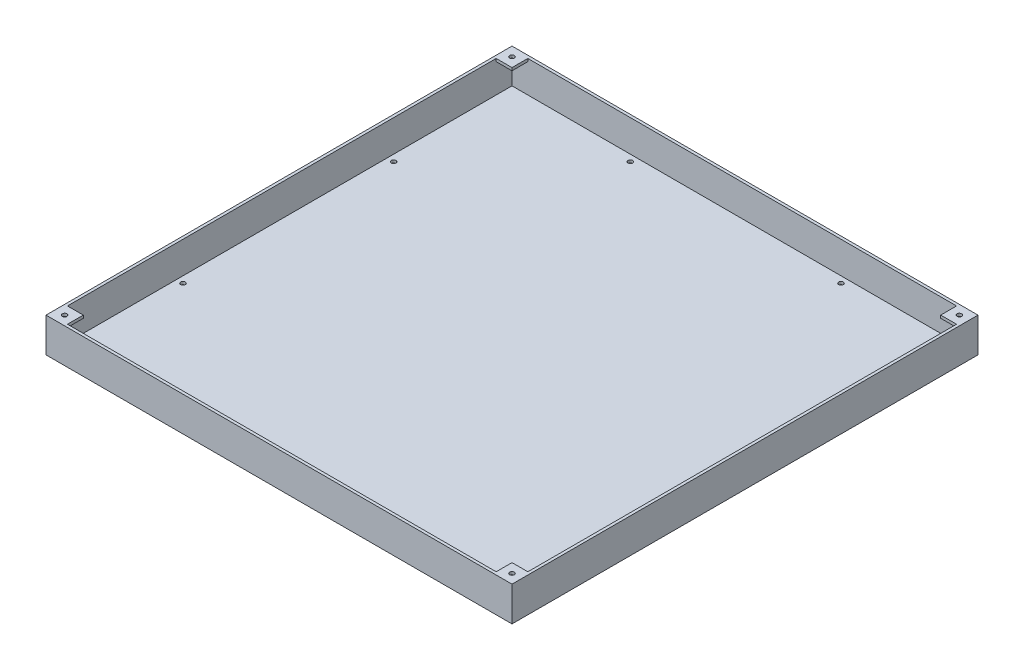
ISO-10303-21;
HEADER;
FILE_DESCRIPTION(('STEP AP214'),'2;1');
FILE_NAME('part.step','',(''),(''),'','','');
FILE_SCHEMA(('AUTOMOTIVE_DESIGN { 1 0 10303 214 1 1 1 1 }'));
ENDSEC;
DATA;
#1=APPLICATION_CONTEXT('core data for automotive mechanical design processes');
#2=APPLICATION_PROTOCOL_DEFINITION('international standard','automotive_design',2000,#1);
#3=PRODUCT_CONTEXT('',#1,'mechanical');
#4=PRODUCT('Part','Part','',(#3));
#5=PRODUCT_RELATED_PRODUCT_CATEGORY('part','',(#4));
#6=PRODUCT_DEFINITION_FORMATION('','',#4);
#7=PRODUCT_DEFINITION_CONTEXT('part definition',#1,'design');
#8=PRODUCT_DEFINITION('design','',#6,#7);
#9=PRODUCT_DEFINITION_SHAPE('','',#8);
#10=(LENGTH_UNIT() NAMED_UNIT(*) SI_UNIT(.MILLI.,.METRE.));
#11=(NAMED_UNIT(*) PLANE_ANGLE_UNIT() SI_UNIT($,.RADIAN.));
#12=(NAMED_UNIT(*) SI_UNIT($,.STERADIAN.) SOLID_ANGLE_UNIT());
#13=UNCERTAINTY_MEASURE_WITH_UNIT(LENGTH_MEASURE(1.E-05),#10,'distance_accuracy_value','');
#14=(GEOMETRIC_REPRESENTATION_CONTEXT(3) GLOBAL_UNCERTAINTY_ASSIGNED_CONTEXT((#13)) GLOBAL_UNIT_ASSIGNED_CONTEXT((#10,
#11,#12)) REPRESENTATION_CONTEXT('',''));
#15=CARTESIAN_POINT('',(0.,0.,0.));
#16=DIRECTION('',(0.,0.,1.));
#17=DIRECTION('',(1.,0.,0.));
#18=AXIS2_PLACEMENT_3D('',#15,#16,#17);
#19=CARTESIAN_POINT('',(250.,37.,-250.));
#20=DIRECTION('',(-1.,0.,0.));
#21=DIRECTION('',(0.,0.,1.));
#22=AXIS2_PLACEMENT_3D('',#19,#20,#21);
#23=PLANE('',#22);
#24=DIRECTION('',(0.,0.,-1.));
#25=VECTOR('',#24,1.);
#26=CARTESIAN_POINT('',(250.,0.,-250.));
#27=LINE('',#26,#25);
#28=CARTESIAN_POINT('',(250.,0.,250.));
#29=VERTEX_POINT('',#28);
#30=CARTESIAN_POINT('',(250.,0.,-250.));
#31=VERTEX_POINT('',#30);
#32=EDGE_CURVE('E302',#29,#31,#27,.T.);
#33=ORIENTED_EDGE('',*,*,#32,.T.);
#34=DIRECTION('',(0.,-1.,0.));
#35=VECTOR('',#34,1.);
#36=CARTESIAN_POINT('',(250.,37.,-250.));
#37=LINE('',#36,#35);
#38=CARTESIAN_POINT('',(250.,37.,-250.));
#39=VERTEX_POINT('',#38);
#40=EDGE_CURVE('E11',#39,#31,#37,.T.);
#41=ORIENTED_EDGE('',*,*,#40,.F.);
#42=DIRECTION('',(0.,0.,-1.));
#43=VECTOR('',#42,1.);
#44=CARTESIAN_POINT('',(250.,37.,-250.));
#45=LINE('',#44,#43);
#46=CARTESIAN_POINT('',(250.,37.,250.));
#47=VERTEX_POINT('',#46);
#48=EDGE_CURVE('E324',#47,#39,#45,.T.);
#49=ORIENTED_EDGE('',*,*,#48,.F.);
#50=DIRECTION('',(0.,-1.,0.));
#51=VECTOR('',#50,1.);
#52=CARTESIAN_POINT('',(250.,37.,250.));
#53=LINE('',#52,#51);
#54=EDGE_CURVE('E334',#47,#29,#53,.T.);
#55=ORIENTED_EDGE('',*,*,#54,.T.);
#56=EDGE_LOOP('',(#33,#41,#49,#55));
#57=FACE_BOUND('',#56,.T.);
#58=ADVANCED_FACE('F33',(#57),#23,.F.);
#59=CARTESIAN_POINT('',(-250.,37.,-250.));
#60=DIRECTION('',(0.,0.,1.));
#61=DIRECTION('',(1.,0.,0.));
#62=AXIS2_PLACEMENT_3D('',#59,#60,#61);
#63=PLANE('',#62);
#64=DIRECTION('',(-1.,0.,0.));
#65=VECTOR('',#64,1.);
#66=CARTESIAN_POINT('',(-250.,0.,-250.));
#67=LINE('',#66,#65);
#68=CARTESIAN_POINT('',(-250.,0.,-250.));
#69=VERTEX_POINT('',#68);
#70=EDGE_CURVE('E337',#31,#69,#67,.T.);
#71=ORIENTED_EDGE('',*,*,#70,.T.);
#72=DIRECTION('',(0.,-1.,0.));
#73=VECTOR('',#72,1.);
#74=CARTESIAN_POINT('',(-250.,37.,-250.));
#75=LINE('',#74,#73);
#76=CARTESIAN_POINT('',(-250.,37.,-250.));
#77=VERTEX_POINT('',#76);
#78=EDGE_CURVE('E41',#77,#69,#75,.T.);
#79=ORIENTED_EDGE('',*,*,#78,.F.);
#80=DIRECTION('',(-1.,0.,0.));
#81=VECTOR('',#80,1.);
#82=CARTESIAN_POINT('',(-250.,37.,-250.));
#83=LINE('',#82,#81);
#84=EDGE_CURVE('E327',#39,#77,#83,.T.);
#85=ORIENTED_EDGE('',*,*,#84,.F.);
#86=ORIENTED_EDGE('',*,*,#40,.T.);
#87=EDGE_LOOP('',(#71,#79,#85,#86));
#88=FACE_BOUND('',#87,.T.);
#89=ADVANCED_FACE('F481',(#88),#63,.F.);
#90=CARTESIAN_POINT('',(-250.,37.,-250.));
#91=DIRECTION('',(1.,0.,0.));
#92=DIRECTION('',(0.,0.,-1.));
#93=AXIS2_PLACEMENT_3D('',#90,#91,#92);
#94=PLANE('',#93);
#95=DIRECTION('',(0.,0.,1.));
#96=VECTOR('',#95,1.);
#97=CARTESIAN_POINT('',(-250.,0.,-250.));
#98=LINE('',#97,#96);
#99=CARTESIAN_POINT('',(-250.,0.,250.));
#100=VERTEX_POINT('',#99);
#101=EDGE_CURVE('E339',#69,#100,#98,.T.);
#102=ORIENTED_EDGE('',*,*,#101,.T.);
#103=DIRECTION('',(0.,-1.,0.));
#104=VECTOR('',#103,1.);
#105=CARTESIAN_POINT('',(-250.,37.,250.));
#106=LINE('',#105,#104);
#107=CARTESIAN_POINT('',(-250.,37.,250.));
#108=VERTEX_POINT('',#107);
#109=EDGE_CURVE('E344',#108,#100,#106,.T.);
#110=ORIENTED_EDGE('',*,*,#109,.F.);
#111=DIRECTION('',(0.,0.,1.));
#112=VECTOR('',#111,1.);
#113=CARTESIAN_POINT('',(-250.,37.,-250.));
#114=LINE('',#113,#112);
#115=EDGE_CURVE('E330',#77,#108,#114,.T.);
#116=ORIENTED_EDGE('',*,*,#115,.F.);
#117=ORIENTED_EDGE('',*,*,#78,.T.);
#118=EDGE_LOOP('',(#102,#110,#116,#117));
#119=FACE_BOUND('',#118,.T.);
#120=ADVANCED_FACE('F486',(#119),#94,.F.);
#121=CARTESIAN_POINT('',(-250.,37.,250.));
#122=DIRECTION('',(0.,0.,-1.));
#123=DIRECTION('',(-1.,0.,0.));
#124=AXIS2_PLACEMENT_3D('',#121,#122,#123);
#125=PLANE('',#124);
#126=DIRECTION('',(1.,0.,0.));
#127=VECTOR('',#126,1.);
#128=CARTESIAN_POINT('',(-250.,0.,250.));
#129=LINE('',#128,#127);
#130=EDGE_CURVE('E328',#100,#29,#129,.T.);
#131=ORIENTED_EDGE('',*,*,#130,.T.);
#132=ORIENTED_EDGE('',*,*,#54,.F.);
#133=DIRECTION('',(1.,0.,0.));
#134=VECTOR('',#133,1.);
#135=CARTESIAN_POINT('',(-250.,37.,250.));
#136=LINE('',#135,#134);
#137=EDGE_CURVE('E332',#108,#47,#136,.T.);
#138=ORIENTED_EDGE('',*,*,#137,.F.);
#139=ORIENTED_EDGE('',*,*,#109,.T.);
#140=EDGE_LOOP('',(#131,#132,#138,#139));
#141=FACE_BOUND('',#140,.T.);
#142=ADVANCED_FACE('F467',(#141),#125,.F.);
#143=CARTESIAN_POINT('',(0.,37.,0.));
#144=DIRECTION('',(0.,1.,0.));
#145=DIRECTION('',(0.,0.,1.));
#146=AXIS2_PLACEMENT_3D('',#143,#144,#145);
#147=PLANE('',#146);
#148=CARTESIAN_POINT('',(-240.,37.,240.));
#149=DIRECTION('',(0.,1.,0.));
#150=DIRECTION('',(0.,0.,-1.));
#151=AXIS2_PLACEMENT_3D('',#148,#149,#150);
#152=CIRCLE('',#151,2.5);
#153=CARTESIAN_POINT('',(-240.,37.,237.5));
#154=VERTEX_POINT('',#153);
#155=EDGE_CURVE('E435',#154,#154,#152,.T.);
#156=ORIENTED_EDGE('',*,*,#155,.F.);
#157=EDGE_LOOP('',(#156));
#158=FACE_BOUND('',#157,.T.);
#159=CARTESIAN_POINT('',(240.,37.,240.));
#160=DIRECTION('',(0.,1.,0.));
#161=DIRECTION('',(0.,0.,1.));
#162=AXIS2_PLACEMENT_3D('',#159,#160,#161);
#163=CIRCLE('',#162,2.5);
#164=CARTESIAN_POINT('',(240.,37.,242.5));
#165=VERTEX_POINT('',#164);
#166=EDGE_CURVE('E441',#165,#165,#163,.T.);
#167=ORIENTED_EDGE('',*,*,#166,.F.);
#168=EDGE_LOOP('',(#167));
#169=FACE_BOUND('',#168,.T.);
#170=CARTESIAN_POINT('',(240.,37.,-240.));
#171=DIRECTION('',(0.,1.,0.));
#172=DIRECTION('',(0.,0.,-1.));
#173=AXIS2_PLACEMENT_3D('',#170,#171,#172);
#174=CIRCLE('',#173,2.5);
#175=CARTESIAN_POINT('',(240.,37.,-242.5));
#176=VERTEX_POINT('',#175);
#177=EDGE_CURVE('E447',#176,#176,#174,.T.);
#178=ORIENTED_EDGE('',*,*,#177,.F.);
#179=EDGE_LOOP('',(#178));
#180=FACE_BOUND('',#179,.T.);
#181=CARTESIAN_POINT('',(-240.,37.,-240.));
#182=DIRECTION('',(0.,1.,0.));
#183=DIRECTION('',(0.,0.,1.));
#184=AXIS2_PLACEMENT_3D('',#181,#182,#183);
#185=CIRCLE('',#184,2.5);
#186=CARTESIAN_POINT('',(-240.,37.,-237.5));
#187=VERTEX_POINT('',#186);
#188=EDGE_CURVE('E429',#187,#187,#185,.T.);
#189=ORIENTED_EDGE('',*,*,#188,.F.);
#190=EDGE_LOOP('',(#189));
#191=FACE_BOUND('',#190,.T.);
#192=DIRECTION('',(0.,0.,-1.));
#193=VECTOR('',#192,1.);
#194=CARTESIAN_POINT('',(247.,37.,-250.));
#195=LINE('',#194,#193);
#196=CARTESIAN_POINT('',(247.,37.,230.));
#197=VERTEX_POINT('',#196);
#198=CARTESIAN_POINT('',(247.,37.,-230.));
#199=VERTEX_POINT('',#198);
#200=EDGE_CURVE('E318',#197,#199,#195,.T.);
#201=ORIENTED_EDGE('',*,*,#200,.F.);
#202=DIRECTION('',(-1.,0.,0.));
#203=VECTOR('',#202,1.);
#204=CARTESIAN_POINT('',(247.,37.,230.));
#205=LINE('',#204,#203);
#206=CARTESIAN_POINT('',(230.,37.,230.));
#207=VERTEX_POINT('',#206);
#208=EDGE_CURVE('E200',#197,#207,#205,.T.);
#209=ORIENTED_EDGE('',*,*,#208,.T.);
#210=DIRECTION('',(0.,0.,1.));
#211=VECTOR('',#210,1.);
#212=CARTESIAN_POINT('',(230.,37.,247.));
#213=LINE('',#212,#211);
#214=CARTESIAN_POINT('',(230.,37.,247.));
#215=VERTEX_POINT('',#214);
#216=EDGE_CURVE('E205',#207,#215,#213,.T.);
#217=ORIENTED_EDGE('',*,*,#216,.T.);
#218=DIRECTION('',(1.,0.,0.));
#219=VECTOR('',#218,1.);
#220=CARTESIAN_POINT('',(-250.,37.,247.));
#221=LINE('',#220,#219);
#222=CARTESIAN_POINT('',(-230.,37.,247.));
#223=VERTEX_POINT('',#222);
#224=EDGE_CURVE('E307',#223,#215,#221,.T.);
#225=ORIENTED_EDGE('',*,*,#224,.F.);
#226=DIRECTION('',(0.,0.,-1.));
#227=VECTOR('',#226,1.);
#228=CARTESIAN_POINT('',(-230.,37.,247.));
#229=LINE('',#228,#227);
#230=CARTESIAN_POINT('',(-230.,37.,230.));
#231=VERTEX_POINT('',#230);
#232=EDGE_CURVE('E196',#223,#231,#229,.T.);
#233=ORIENTED_EDGE('',*,*,#232,.T.);
#234=DIRECTION('',(-1.,0.,0.));
#235=VECTOR('',#234,1.);
#236=CARTESIAN_POINT('',(-247.,37.,230.));
#237=LINE('',#236,#235);
#238=CARTESIAN_POINT('',(-247.,37.,230.));
#239=VERTEX_POINT('',#238);
#240=EDGE_CURVE('E175',#231,#239,#237,.T.);
#241=ORIENTED_EDGE('',*,*,#240,.T.);
#242=DIRECTION('',(0.,0.,1.));
#243=VECTOR('',#242,1.);
#244=CARTESIAN_POINT('',(-247.,37.,-250.));
#245=LINE('',#244,#243);
#246=CARTESIAN_POINT('',(-247.,37.,-230.));
#247=VERTEX_POINT('',#246);
#248=EDGE_CURVE('E54',#247,#239,#245,.T.);
#249=ORIENTED_EDGE('',*,*,#248,.F.);
#250=DIRECTION('',(1.,0.,0.));
#251=VECTOR('',#250,1.);
#252=CARTESIAN_POINT('',(-247.,37.,-230.));
#253=LINE('',#252,#251);
#254=CARTESIAN_POINT('',(-230.,37.,-230.));
#255=VERTEX_POINT('',#254);
#256=EDGE_CURVE('E244',#247,#255,#253,.T.);
#257=ORIENTED_EDGE('',*,*,#256,.T.);
#258=DIRECTION('',(0.,0.,-1.));
#259=VECTOR('',#258,1.);
#260=CARTESIAN_POINT('',(-230.,37.,-247.));
#261=LINE('',#260,#259);
#262=CARTESIAN_POINT('',(-230.,37.,-247.));
#263=VERTEX_POINT('',#262);
#264=EDGE_CURVE('E252',#255,#263,#261,.T.);
#265=ORIENTED_EDGE('',*,*,#264,.T.);
#266=DIRECTION('',(-1.,0.,0.));
#267=VECTOR('',#266,1.);
#268=CARTESIAN_POINT('',(-250.,37.,-247.));
#269=LINE('',#268,#267);
#270=CARTESIAN_POINT('',(230.,37.,-247.));
#271=VERTEX_POINT('',#270);
#272=EDGE_CURVE('E320',#271,#263,#269,.T.);
#273=ORIENTED_EDGE('',*,*,#272,.F.);
#274=DIRECTION('',(0.,0.,1.));
#275=VECTOR('',#274,1.);
#276=CARTESIAN_POINT('',(230.,37.,-247.));
#277=LINE('',#276,#275);
#278=CARTESIAN_POINT('',(230.,37.,-230.));
#279=VERTEX_POINT('',#278);
#280=EDGE_CURVE('E221',#271,#279,#277,.T.);
#281=ORIENTED_EDGE('',*,*,#280,.T.);
#282=DIRECTION('',(1.,0.,0.));
#283=VECTOR('',#282,1.);
#284=CARTESIAN_POINT('',(247.,37.,-230.));
#285=LINE('',#284,#283);
#286=EDGE_CURVE('E228',#279,#199,#285,.T.);
#287=ORIENTED_EDGE('',*,*,#286,.T.);
#288=EDGE_LOOP('',(#201,#209,#217,#225,#233,#241,#249,#257,#265,#273,#281,#287));
#289=FACE_BOUND('',#288,.T.);
#290=ORIENTED_EDGE('',*,*,#48,.T.);
#291=ORIENTED_EDGE('',*,*,#84,.T.);
#292=ORIENTED_EDGE('',*,*,#115,.T.);
#293=ORIENTED_EDGE('',*,*,#137,.T.);
#294=EDGE_LOOP('',(#290,#291,#292,#293));
#295=FACE_BOUND('',#294,.T.);
#296=ADVANCED_FACE('F422',(#158,#169,#180,#191,#289,#295),#147,.T.);
#297=CARTESIAN_POINT('',(0.,0.,0.));
#298=DIRECTION('',(0.,1.,0.));
#299=DIRECTION('',(0.,0.,1.));
#300=AXIS2_PLACEMENT_3D('',#297,#298,#299);
#301=PLANE('',#300);
#302=CARTESIAN_POINT('',(-240.,0.,113.));
#303=DIRECTION('',(0.,1.,0.));
#304=DIRECTION('',(0.,0.,1.));
#305=AXIS2_PLACEMENT_3D('',#302,#303,#304);
#306=CIRCLE('',#305,2.5);
#307=CARTESIAN_POINT('',(-240.,0.,115.5));
#308=VERTEX_POINT('',#307);
#309=EDGE_CURVE('E275',#308,#308,#306,.F.);
#310=ORIENTED_EDGE('',*,*,#309,.F.);
#311=EDGE_LOOP('',(#310));
#312=FACE_BOUND('',#311,.T.);
#313=CARTESIAN_POINT('',(240.,0.,113.));
#314=DIRECTION('',(0.,1.,0.));
#315=DIRECTION('',(0.,0.,1.));
#316=AXIS2_PLACEMENT_3D('',#313,#314,#315);
#317=CIRCLE('',#316,2.5);
#318=CARTESIAN_POINT('',(240.,0.,115.5));
#319=VERTEX_POINT('',#318);
#320=EDGE_CURVE('E281',#319,#319,#317,.F.);
#321=ORIENTED_EDGE('',*,*,#320,.F.);
#322=EDGE_LOOP('',(#321));
#323=FACE_BOUND('',#322,.T.);
#324=CARTESIAN_POINT('',(240.,0.,-113.));
#325=DIRECTION('',(0.,1.,0.));
#326=DIRECTION('',(0.,0.,1.));
#327=AXIS2_PLACEMENT_3D('',#324,#325,#326);
#328=CIRCLE('',#327,2.49999999999989);
#329=CARTESIAN_POINT('',(240.,0.,-110.5));
#330=VERTEX_POINT('',#329);
#331=EDGE_CURVE('E284',#330,#330,#328,.F.);
#332=ORIENTED_EDGE('',*,*,#331,.F.);
#333=EDGE_LOOP('',(#332));
#334=FACE_BOUND('',#333,.T.);
#335=CARTESIAN_POINT('',(-113.,0.,240.));
#336=DIRECTION('',(0.,1.,0.));
#337=DIRECTION('',(0.,0.,1.));
#338=AXIS2_PLACEMENT_3D('',#335,#336,#337);
#339=CIRCLE('',#338,2.5);
#340=CARTESIAN_POINT('',(-113.,0.,242.5));
#341=VERTEX_POINT('',#340);
#342=EDGE_CURVE('E287',#341,#341,#339,.F.);
#343=ORIENTED_EDGE('',*,*,#342,.F.);
#344=EDGE_LOOP('',(#343));
#345=FACE_BOUND('',#344,.T.);
#346=CARTESIAN_POINT('',(-240.,0.,-113.));
#347=DIRECTION('',(0.,1.,0.));
#348=DIRECTION('',(0.,0.,1.));
#349=AXIS2_PLACEMENT_3D('',#346,#347,#348);
#350=CIRCLE('',#349,2.49999999999998);
#351=CARTESIAN_POINT('',(-240.,0.,-110.5));
#352=VERTEX_POINT('',#351);
#353=EDGE_CURVE('E272',#352,#352,#350,.F.);
#354=ORIENTED_EDGE('',*,*,#353,.F.);
#355=EDGE_LOOP('',(#354));
#356=FACE_BOUND('',#355,.T.);
#357=CARTESIAN_POINT('',(-113.,0.,-240.));
#358=DIRECTION('',(0.,1.,0.));
#359=DIRECTION('',(0.,0.,1.));
#360=AXIS2_PLACEMENT_3D('',#357,#358,#359);
#361=CIRCLE('',#360,2.49999999999991);
#362=CARTESIAN_POINT('',(-113.,0.,-237.5));
#363=VERTEX_POINT('',#362);
#364=EDGE_CURVE('E276',#363,#363,#361,.F.);
#365=ORIENTED_EDGE('',*,*,#364,.F.);
#366=EDGE_LOOP('',(#365));
#367=FACE_BOUND('',#366,.T.);
#368=CARTESIAN_POINT('',(113.,0.,-240.));
#369=DIRECTION('',(0.,1.,0.));
#370=DIRECTION('',(0.,0.,1.));
#371=AXIS2_PLACEMENT_3D('',#368,#369,#370);
#372=CIRCLE('',#371,2.49999999999996);
#373=CARTESIAN_POINT('',(113.,0.,-237.5));
#374=VERTEX_POINT('',#373);
#375=EDGE_CURVE('E268',#374,#374,#372,.F.);
#376=ORIENTED_EDGE('',*,*,#375,.F.);
#377=EDGE_LOOP('',(#376));
#378=FACE_BOUND('',#377,.T.);
#379=CARTESIAN_POINT('',(113.,0.,240.));
#380=DIRECTION('',(0.,1.,0.));
#381=DIRECTION('',(0.,0.,1.));
#382=AXIS2_PLACEMENT_3D('',#379,#380,#381);
#383=CIRCLE('',#382,2.5);
#384=CARTESIAN_POINT('',(113.,0.,242.5));
#385=VERTEX_POINT('',#384);
#386=EDGE_CURVE('E290',#385,#385,#383,.F.);
#387=ORIENTED_EDGE('',*,*,#386,.F.);
#388=EDGE_LOOP('',(#387));
#389=FACE_BOUND('',#388,.T.);
#390=ORIENTED_EDGE('',*,*,#32,.F.);
#391=ORIENTED_EDGE('',*,*,#130,.F.);
#392=ORIENTED_EDGE('',*,*,#101,.F.);
#393=ORIENTED_EDGE('',*,*,#70,.F.);
#394=EDGE_LOOP('',(#390,#391,#392,#393));
#395=FACE_BOUND('',#394,.T.);
#396=ADVANCED_FACE('F466',(#312,#323,#334,#345,#356,#367,#378,#389,#395),#301,.F.);
#397=CARTESIAN_POINT('',(247.,37.,-250.));
#398=DIRECTION('',(-1.,0.,0.));
#399=DIRECTION('',(0.,0.,1.));
#400=AXIS2_PLACEMENT_3D('',#397,#398,#399);
#401=PLANE('',#400);
#402=DIRECTION('',(0.,1.,0.));
#403=VECTOR('',#402,1.);
#404=CARTESIAN_POINT('',(247.,34.,230.));
#405=LINE('',#404,#403);
#406=CARTESIAN_POINT('',(247.,34.,230.));
#407=VERTEX_POINT('',#406);
#408=EDGE_CURVE('E213',#407,#197,#405,.T.);
#409=ORIENTED_EDGE('',*,*,#408,.T.);
#410=ORIENTED_EDGE('',*,*,#200,.T.);
#411=DIRECTION('',(0.,1.,0.));
#412=VECTOR('',#411,1.);
#413=CARTESIAN_POINT('',(247.,34.,-230.));
#414=LINE('',#413,#412);
#415=CARTESIAN_POINT('',(247.,34.,-230.));
#416=VERTEX_POINT('',#415);
#417=EDGE_CURVE('E241',#416,#199,#414,.T.);
#418=ORIENTED_EDGE('',*,*,#417,.F.);
#419=DIRECTION('',(0.,0.,-1.));
#420=VECTOR('',#419,1.);
#421=CARTESIAN_POINT('',(247.,34.,-247.));
#422=LINE('',#421,#420);
#423=CARTESIAN_POINT('',(247.,34.,-247.));
#424=VERTEX_POINT('',#423);
#425=EDGE_CURVE('E225',#416,#424,#422,.T.);
#426=ORIENTED_EDGE('',*,*,#425,.T.);
#427=DIRECTION('',(0.,-1.,0.));
#428=VECTOR('',#427,1.);
#429=CARTESIAN_POINT('',(247.,37.,-247.));
#430=LINE('',#429,#428);
#431=CARTESIAN_POINT('',(247.,3.,-247.));
#432=VERTEX_POINT('',#431);
#433=EDGE_CURVE('E300',#424,#432,#430,.T.);
#434=ORIENTED_EDGE('',*,*,#433,.T.);
#435=DIRECTION('',(0.,0.,-1.));
#436=VECTOR('',#435,1.);
#437=CARTESIAN_POINT('',(247.,3.,-250.));
#438=LINE('',#437,#436);
#439=CARTESIAN_POINT('',(247.,3.,247.));
#440=VERTEX_POINT('',#439);
#441=EDGE_CURVE('E296',#440,#432,#438,.T.);
#442=ORIENTED_EDGE('',*,*,#441,.F.);
#443=DIRECTION('',(0.,-1.,0.));
#444=VECTOR('',#443,1.);
#445=CARTESIAN_POINT('',(247.,37.,247.));
#446=LINE('',#445,#444);
#447=CARTESIAN_POINT('',(247.,34.,247.));
#448=VERTEX_POINT('',#447);
#449=EDGE_CURVE('E304',#448,#440,#446,.T.);
#450=ORIENTED_EDGE('',*,*,#449,.F.);
#451=DIRECTION('',(0.,0.,-1.));
#452=VECTOR('',#451,1.);
#453=CARTESIAN_POINT('',(247.,34.,247.));
#454=LINE('',#453,#452);
#455=EDGE_CURVE('E204',#448,#407,#454,.T.);
#456=ORIENTED_EDGE('',*,*,#455,.T.);
#457=EDGE_LOOP('',(#409,#410,#418,#426,#434,#442,#450,#456));
#458=FACE_BOUND('',#457,.T.);
#459=ADVANCED_FACE('F400',(#458),#401,.T.);
#460=CARTESIAN_POINT('',(-250.,37.,-247.));
#461=DIRECTION('',(0.,0.,1.));
#462=DIRECTION('',(1.,0.,0.));
#463=AXIS2_PLACEMENT_3D('',#460,#461,#462);
#464=PLANE('',#463);
#465=DIRECTION('',(0.,1.,0.));
#466=VECTOR('',#465,1.);
#467=CARTESIAN_POINT('',(230.,34.,-247.));
#468=LINE('',#467,#466);
#469=CARTESIAN_POINT('',(230.,34.,-247.));
#470=VERTEX_POINT('',#469);
#471=EDGE_CURVE('E236',#470,#271,#468,.T.);
#472=ORIENTED_EDGE('',*,*,#471,.T.);
#473=ORIENTED_EDGE('',*,*,#272,.T.);
#474=DIRECTION('',(0.,1.,0.));
#475=VECTOR('',#474,1.);
#476=CARTESIAN_POINT('',(-230.,34.,-247.));
#477=LINE('',#476,#475);
#478=CARTESIAN_POINT('',(-230.,34.,-247.));
#479=VERTEX_POINT('',#478);
#480=EDGE_CURVE('E265',#479,#263,#477,.T.);
#481=ORIENTED_EDGE('',*,*,#480,.F.);
#482=DIRECTION('',(-1.,0.,0.));
#483=VECTOR('',#482,1.);
#484=CARTESIAN_POINT('',(-247.,34.,-247.));
#485=LINE('',#484,#483);
#486=CARTESIAN_POINT('',(-247.,34.,-247.));
#487=VERTEX_POINT('',#486);
#488=EDGE_CURVE('E258',#479,#487,#485,.T.);
#489=ORIENTED_EDGE('',*,*,#488,.T.);
#490=DIRECTION('',(0.,-1.,0.));
#491=VECTOR('',#490,1.);
#492=CARTESIAN_POINT('',(-247.,37.,-247.));
#493=LINE('',#492,#491);
#494=CARTESIAN_POINT('',(-247.,3.,-247.));
#495=VERTEX_POINT('',#494);
#496=EDGE_CURVE('E303',#487,#495,#493,.T.);
#497=ORIENTED_EDGE('',*,*,#496,.T.);
#498=DIRECTION('',(-1.,0.,0.));
#499=VECTOR('',#498,1.);
#500=CARTESIAN_POINT('',(-250.,3.,-247.));
#501=LINE('',#500,#499);
#502=EDGE_CURVE('E299',#432,#495,#501,.T.);
#503=ORIENTED_EDGE('',*,*,#502,.F.);
#504=ORIENTED_EDGE('',*,*,#433,.F.);
#505=DIRECTION('',(-1.,0.,0.));
#506=VECTOR('',#505,1.);
#507=CARTESIAN_POINT('',(247.,34.,-247.));
#508=LINE('',#507,#506);
#509=EDGE_CURVE('E227',#424,#470,#508,.T.);
#510=ORIENTED_EDGE('',*,*,#509,.T.);
#511=EDGE_LOOP('',(#472,#473,#481,#489,#497,#503,#504,#510));
#512=FACE_BOUND('',#511,.T.);
#513=ADVANCED_FACE('F406',(#512),#464,.T.);
#514=CARTESIAN_POINT('',(-247.,37.,-250.));
#515=DIRECTION('',(1.,0.,0.));
#516=DIRECTION('',(0.,0.,-1.));
#517=AXIS2_PLACEMENT_3D('',#514,#515,#516);
#518=PLANE('',#517);
#519=DIRECTION('',(0.,1.,0.));
#520=VECTOR('',#519,1.);
#521=CARTESIAN_POINT('',(-247.,34.,230.));
#522=LINE('',#521,#520);
#523=CARTESIAN_POINT('',(-247.,34.,230.));
#524=VERTEX_POINT('',#523);
#525=EDGE_CURVE('E49',#524,#239,#522,.T.);
#526=ORIENTED_EDGE('',*,*,#525,.F.);
#527=DIRECTION('',(0.,0.,1.));
#528=VECTOR('',#527,1.);
#529=CARTESIAN_POINT('',(-247.,34.,247.));
#530=LINE('',#529,#528);
#531=CARTESIAN_POINT('',(-247.,34.,247.));
#532=VERTEX_POINT('',#531);
#533=EDGE_CURVE('E191',#524,#532,#530,.T.);
#534=ORIENTED_EDGE('',*,*,#533,.T.);
#535=DIRECTION('',(0.,-1.,0.));
#536=VECTOR('',#535,1.);
#537=CARTESIAN_POINT('',(-247.,37.,247.));
#538=LINE('',#537,#536);
#539=CARTESIAN_POINT('',(-247.,3.,247.));
#540=VERTEX_POINT('',#539);
#541=EDGE_CURVE('E306',#532,#540,#538,.T.);
#542=ORIENTED_EDGE('',*,*,#541,.T.);
#543=DIRECTION('',(0.,0.,1.));
#544=VECTOR('',#543,1.);
#545=CARTESIAN_POINT('',(-247.,3.,-250.));
#546=LINE('',#545,#544);
#547=EDGE_CURVE('E310',#495,#540,#546,.T.);
#548=ORIENTED_EDGE('',*,*,#547,.F.);
#549=ORIENTED_EDGE('',*,*,#496,.F.);
#550=DIRECTION('',(0.,0.,1.));
#551=VECTOR('',#550,1.);
#552=CARTESIAN_POINT('',(-247.,34.,-247.));
#553=LINE('',#552,#551);
#554=CARTESIAN_POINT('',(-247.,34.,-230.));
#555=VERTEX_POINT('',#554);
#556=EDGE_CURVE('E249',#487,#555,#553,.T.);
#557=ORIENTED_EDGE('',*,*,#556,.T.);
#558=DIRECTION('',(0.,1.,0.));
#559=VECTOR('',#558,1.);
#560=CARTESIAN_POINT('',(-247.,34.,-230.));
#561=LINE('',#560,#559);
#562=EDGE_CURVE('E260',#555,#247,#561,.T.);
#563=ORIENTED_EDGE('',*,*,#562,.T.);
#564=ORIENTED_EDGE('',*,*,#248,.T.);
#565=EDGE_LOOP('',(#526,#534,#542,#548,#549,#557,#563,#564));
#566=FACE_BOUND('',#565,.T.);
#567=ADVANCED_FACE('F410',(#566),#518,.T.);
#568=CARTESIAN_POINT('',(-250.,37.,247.));
#569=DIRECTION('',(0.,0.,-1.));
#570=DIRECTION('',(-1.,0.,0.));
#571=AXIS2_PLACEMENT_3D('',#568,#569,#570);
#572=PLANE('',#571);
#573=DIRECTION('',(0.,1.,0.));
#574=VECTOR('',#573,1.);
#575=CARTESIAN_POINT('',(-230.,34.,247.));
#576=LINE('',#575,#574);
#577=CARTESIAN_POINT('',(-230.,34.,247.));
#578=VERTEX_POINT('',#577);
#579=EDGE_CURVE('E179',#578,#223,#576,.T.);
#580=ORIENTED_EDGE('',*,*,#579,.T.);
#581=ORIENTED_EDGE('',*,*,#224,.T.);
#582=DIRECTION('',(0.,1.,0.));
#583=VECTOR('',#582,1.);
#584=CARTESIAN_POINT('',(230.,34.,247.));
#585=LINE('',#584,#583);
#586=CARTESIAN_POINT('',(230.,34.,247.));
#587=VERTEX_POINT('',#586);
#588=EDGE_CURVE('E218',#587,#215,#585,.T.);
#589=ORIENTED_EDGE('',*,*,#588,.F.);
#590=DIRECTION('',(1.,0.,0.));
#591=VECTOR('',#590,1.);
#592=CARTESIAN_POINT('',(247.,34.,247.));
#593=LINE('',#592,#591);
#594=EDGE_CURVE('E202',#587,#448,#593,.T.);
#595=ORIENTED_EDGE('',*,*,#594,.T.);
#596=ORIENTED_EDGE('',*,*,#449,.T.);
#597=DIRECTION('',(1.,0.,0.));
#598=VECTOR('',#597,1.);
#599=CARTESIAN_POINT('',(-250.,3.,247.));
#600=LINE('',#599,#598);
#601=EDGE_CURVE('E314',#540,#440,#600,.T.);
#602=ORIENTED_EDGE('',*,*,#601,.F.);
#603=ORIENTED_EDGE('',*,*,#541,.F.);
#604=DIRECTION('',(1.,0.,0.));
#605=VECTOR('',#604,1.);
#606=CARTESIAN_POINT('',(-247.,34.,247.));
#607=LINE('',#606,#605);
#608=EDGE_CURVE('E188',#532,#578,#607,.T.);
#609=ORIENTED_EDGE('',*,*,#608,.T.);
#610=EDGE_LOOP('',(#580,#581,#589,#595,#596,#602,#603,#609));
#611=FACE_BOUND('',#610,.T.);
#612=ADVANCED_FACE('F379',(#611),#572,.T.);
#613=CARTESIAN_POINT('',(0.,3.,0.));
#614=DIRECTION('',(0.,1.,0.));
#615=DIRECTION('',(0.,0.,1.));
#616=AXIS2_PLACEMENT_3D('',#613,#614,#615);
#617=PLANE('',#616);
#618=CARTESIAN_POINT('',(-240.,3.,113.));
#619=DIRECTION('',(0.,1.,0.));
#620=DIRECTION('',(0.,0.,1.));
#621=AXIS2_PLACEMENT_3D('',#618,#619,#620);
#622=CIRCLE('',#621,2.5);
#623=CARTESIAN_POINT('',(-240.,3.,115.5));
#624=VERTEX_POINT('',#623);
#625=EDGE_CURVE('E36',#624,#624,#622,.T.);
#626=ORIENTED_EDGE('',*,*,#625,.F.);
#627=EDGE_LOOP('',(#626));
#628=FACE_BOUND('',#627,.T.);
#629=CARTESIAN_POINT('',(240.,3.,113.));
#630=DIRECTION('',(0.,1.,0.));
#631=DIRECTION('',(0.,0.,1.));
#632=AXIS2_PLACEMENT_3D('',#629,#630,#631);
#633=CIRCLE('',#632,2.5);
#634=CARTESIAN_POINT('',(240.,3.,115.5));
#635=VERTEX_POINT('',#634);
#636=EDGE_CURVE('E365',#635,#635,#633,.T.);
#637=ORIENTED_EDGE('',*,*,#636,.F.);
#638=EDGE_LOOP('',(#637));
#639=FACE_BOUND('',#638,.T.);
#640=CARTESIAN_POINT('',(240.,3.,-113.));
#641=DIRECTION('',(0.,1.,0.));
#642=DIRECTION('',(0.,0.,1.));
#643=AXIS2_PLACEMENT_3D('',#640,#641,#642);
#644=CIRCLE('',#643,2.49999999999989);
#645=CARTESIAN_POINT('',(240.,3.,-110.5));
#646=VERTEX_POINT('',#645);
#647=EDGE_CURVE('E363',#646,#646,#644,.T.);
#648=ORIENTED_EDGE('',*,*,#647,.F.);
#649=EDGE_LOOP('',(#648));
#650=FACE_BOUND('',#649,.T.);
#651=CARTESIAN_POINT('',(-113.,3.,240.));
#652=DIRECTION('',(0.,1.,0.));
#653=DIRECTION('',(0.,0.,1.));
#654=AXIS2_PLACEMENT_3D('',#651,#652,#653);
#655=CIRCLE('',#654,2.5);
#656=CARTESIAN_POINT('',(-113.,3.,242.5));
#657=VERTEX_POINT('',#656);
#658=EDGE_CURVE('E360',#657,#657,#655,.T.);
#659=ORIENTED_EDGE('',*,*,#658,.F.);
#660=EDGE_LOOP('',(#659));
#661=FACE_BOUND('',#660,.T.);
#662=CARTESIAN_POINT('',(-240.,3.,-113.));
#663=DIRECTION('',(0.,1.,0.));
#664=DIRECTION('',(0.,0.,1.));
#665=AXIS2_PLACEMENT_3D('',#662,#663,#664);
#666=CIRCLE('',#665,2.49999999999998);
#667=CARTESIAN_POINT('',(-240.,3.,-110.5));
#668=VERTEX_POINT('',#667);
#669=EDGE_CURVE('E357',#668,#668,#666,.T.);
#670=ORIENTED_EDGE('',*,*,#669,.F.);
#671=EDGE_LOOP('',(#670));
#672=FACE_BOUND('',#671,.T.);
#673=CARTESIAN_POINT('',(-113.,3.,-240.));
#674=DIRECTION('',(0.,1.,0.));
#675=DIRECTION('',(0.,0.,1.));
#676=AXIS2_PLACEMENT_3D('',#673,#674,#675);
#677=CIRCLE('',#676,2.49999999999991);
#678=CARTESIAN_POINT('',(-113.,3.,-237.5));
#679=VERTEX_POINT('',#678);
#680=EDGE_CURVE('E354',#679,#679,#677,.T.);
#681=ORIENTED_EDGE('',*,*,#680,.F.);
#682=EDGE_LOOP('',(#681));
#683=FACE_BOUND('',#682,.T.);
#684=CARTESIAN_POINT('',(113.,3.,-240.));
#685=DIRECTION('',(0.,1.,0.));
#686=DIRECTION('',(0.,0.,1.));
#687=AXIS2_PLACEMENT_3D('',#684,#685,#686);
#688=CIRCLE('',#687,2.49999999999996);
#689=CARTESIAN_POINT('',(113.,3.,-237.5));
#690=VERTEX_POINT('',#689);
#691=EDGE_CURVE('E351',#690,#690,#688,.T.);
#692=ORIENTED_EDGE('',*,*,#691,.F.);
#693=EDGE_LOOP('',(#692));
#694=FACE_BOUND('',#693,.T.);
#695=CARTESIAN_POINT('',(113.,3.,240.));
#696=DIRECTION('',(0.,1.,0.));
#697=DIRECTION('',(0.,0.,1.));
#698=AXIS2_PLACEMENT_3D('',#695,#696,#697);
#699=CIRCLE('',#698,2.5);
#700=CARTESIAN_POINT('',(113.,3.,242.5));
#701=VERTEX_POINT('',#700);
#702=EDGE_CURVE('E295',#701,#701,#699,.T.);
#703=ORIENTED_EDGE('',*,*,#702,.F.);
#704=EDGE_LOOP('',(#703));
#705=FACE_BOUND('',#704,.T.);
#706=ORIENTED_EDGE('',*,*,#441,.T.);
#707=ORIENTED_EDGE('',*,*,#502,.T.);
#708=ORIENTED_EDGE('',*,*,#547,.T.);
#709=ORIENTED_EDGE('',*,*,#601,.T.);
#710=EDGE_LOOP('',(#706,#707,#708,#709));
#711=FACE_BOUND('',#710,.T.);
#712=ADVANCED_FACE('F375',(#628,#639,#650,#661,#672,#683,#694,#705,#711),#617,.T.);
#713=CARTESIAN_POINT('',(113.,-7.07106781186548,240.));
#714=DIRECTION('',(0.,1.,0.));
#715=DIRECTION('',(0.,0.,1.));
#716=AXIS2_PLACEMENT_3D('',#713,#714,#715);
#717=CYLINDRICAL_SURFACE('',#716,2.5);
#718=ORIENTED_EDGE('',*,*,#702,.T.);
#719=EDGE_LOOP('',(#718));
#720=FACE_BOUND('',#719,.T.);
#721=ORIENTED_EDGE('',*,*,#386,.T.);
#722=EDGE_LOOP('',(#721));
#723=FACE_BOUND('',#722,.T.);
#724=ADVANCED_FACE('F378',(#720,#723),#717,.F.);
#725=CARTESIAN_POINT('',(113.,-7.07106781186548,-240.));
#726=DIRECTION('',(0.,1.,0.));
#727=DIRECTION('',(0.,0.,1.));
#728=AXIS2_PLACEMENT_3D('',#725,#726,#727);
#729=CYLINDRICAL_SURFACE('',#728,2.49999999999996);
#730=ORIENTED_EDGE('',*,*,#691,.T.);
#731=EDGE_LOOP('',(#730));
#732=FACE_BOUND('',#731,.T.);
#733=ORIENTED_EDGE('',*,*,#375,.T.);
#734=EDGE_LOOP('',(#733));
#735=FACE_BOUND('',#734,.T.);
#736=ADVANCED_FACE('F521',(#732,#735),#729,.F.);
#737=CARTESIAN_POINT('',(-113.,-7.07106781186548,-240.));
#738=DIRECTION('',(0.,1.,0.));
#739=DIRECTION('',(0.,0.,1.));
#740=AXIS2_PLACEMENT_3D('',#737,#738,#739);
#741=CYLINDRICAL_SURFACE('',#740,2.49999999999991);
#742=ORIENTED_EDGE('',*,*,#680,.T.);
#743=EDGE_LOOP('',(#742));
#744=FACE_BOUND('',#743,.T.);
#745=ORIENTED_EDGE('',*,*,#364,.T.);
#746=EDGE_LOOP('',(#745));
#747=FACE_BOUND('',#746,.T.);
#748=ADVANCED_FACE('F540',(#744,#747),#741,.F.);
#749=CARTESIAN_POINT('',(-240.,-7.07106781186548,-113.));
#750=DIRECTION('',(0.,1.,0.));
#751=DIRECTION('',(0.,0.,1.));
#752=AXIS2_PLACEMENT_3D('',#749,#750,#751);
#753=CYLINDRICAL_SURFACE('',#752,2.49999999999998);
#754=ORIENTED_EDGE('',*,*,#669,.T.);
#755=EDGE_LOOP('',(#754));
#756=FACE_BOUND('',#755,.T.);
#757=ORIENTED_EDGE('',*,*,#353,.T.);
#758=EDGE_LOOP('',(#757));
#759=FACE_BOUND('',#758,.T.);
#760=ADVANCED_FACE('F531',(#756,#759),#753,.F.);
#761=CARTESIAN_POINT('',(-113.,-7.07106781186548,240.));
#762=DIRECTION('',(0.,1.,0.));
#763=DIRECTION('',(0.,0.,1.));
#764=AXIS2_PLACEMENT_3D('',#761,#762,#763);
#765=CYLINDRICAL_SURFACE('',#764,2.5);
#766=ORIENTED_EDGE('',*,*,#658,.T.);
#767=EDGE_LOOP('',(#766));
#768=FACE_BOUND('',#767,.T.);
#769=ORIENTED_EDGE('',*,*,#342,.T.);
#770=EDGE_LOOP('',(#769));
#771=FACE_BOUND('',#770,.T.);
#772=ADVANCED_FACE('F527',(#768,#771),#765,.F.);
#773=CARTESIAN_POINT('',(240.,-7.07106781186548,-113.));
#774=DIRECTION('',(0.,1.,0.));
#775=DIRECTION('',(0.,0.,1.));
#776=AXIS2_PLACEMENT_3D('',#773,#774,#775);
#777=CYLINDRICAL_SURFACE('',#776,2.49999999999989);
#778=ORIENTED_EDGE('',*,*,#647,.T.);
#779=EDGE_LOOP('',(#778));
#780=FACE_BOUND('',#779,.T.);
#781=ORIENTED_EDGE('',*,*,#331,.T.);
#782=EDGE_LOOP('',(#781));
#783=FACE_BOUND('',#782,.T.);
#784=ADVANCED_FACE('F523',(#780,#783),#777,.F.);
#785=CARTESIAN_POINT('',(240.,-7.07106781186548,113.));
#786=DIRECTION('',(0.,1.,0.));
#787=DIRECTION('',(0.,0.,1.));
#788=AXIS2_PLACEMENT_3D('',#785,#786,#787);
#789=CYLINDRICAL_SURFACE('',#788,2.5);
#790=ORIENTED_EDGE('',*,*,#636,.T.);
#791=EDGE_LOOP('',(#790));
#792=FACE_BOUND('',#791,.T.);
#793=ORIENTED_EDGE('',*,*,#320,.T.);
#794=EDGE_LOOP('',(#793));
#795=FACE_BOUND('',#794,.T.);
#796=ADVANCED_FACE('F526',(#792,#795),#789,.F.);
#797=CARTESIAN_POINT('',(-240.,-7.07106781186548,113.));
#798=DIRECTION('',(0.,1.,0.));
#799=DIRECTION('',(0.,0.,1.));
#800=AXIS2_PLACEMENT_3D('',#797,#798,#799);
#801=CYLINDRICAL_SURFACE('',#800,2.5);
#802=ORIENTED_EDGE('',*,*,#625,.T.);
#803=EDGE_LOOP('',(#802));
#804=FACE_BOUND('',#803,.T.);
#805=ORIENTED_EDGE('',*,*,#309,.T.);
#806=EDGE_LOOP('',(#805));
#807=FACE_BOUND('',#806,.T.);
#808=ADVANCED_FACE('F372',(#804,#807),#801,.F.);
#809=CARTESIAN_POINT('',(-230.,34.,-247.));
#810=DIRECTION('',(1.,0.,0.));
#811=DIRECTION('',(0.,0.,-1.));
#812=AXIS2_PLACEMENT_3D('',#809,#810,#811);
#813=PLANE('',#812);
#814=ORIENTED_EDGE('',*,*,#264,.F.);
#815=DIRECTION('',(0.,1.,0.));
#816=VECTOR('',#815,1.);
#817=CARTESIAN_POINT('',(-230.,34.,-230.));
#818=LINE('',#817,#816);
#819=CARTESIAN_POINT('',(-230.,34.,-230.));
#820=VERTEX_POINT('',#819);
#821=EDGE_CURVE('E269',#820,#255,#818,.T.);
#822=ORIENTED_EDGE('',*,*,#821,.F.);
#823=DIRECTION('',(0.,0.,-1.));
#824=VECTOR('',#823,1.);
#825=CARTESIAN_POINT('',(-230.,34.,-247.));
#826=LINE('',#825,#824);
#827=EDGE_CURVE('E255',#820,#479,#826,.T.);
#828=ORIENTED_EDGE('',*,*,#827,.T.);
#829=ORIENTED_EDGE('',*,*,#480,.T.);
#830=EDGE_LOOP('',(#814,#822,#828,#829));
#831=FACE_BOUND('',#830,.T.);
#832=ADVANCED_FACE('F535',(#831),#813,.T.);
#833=CARTESIAN_POINT('',(-247.,34.,-230.));
#834=DIRECTION('',(0.,0.,1.));
#835=DIRECTION('',(1.,0.,0.));
#836=AXIS2_PLACEMENT_3D('',#833,#834,#835);
#837=PLANE('',#836);
#838=ORIENTED_EDGE('',*,*,#256,.F.);
#839=ORIENTED_EDGE('',*,*,#562,.F.);
#840=DIRECTION('',(1.,0.,0.));
#841=VECTOR('',#840,1.);
#842=CARTESIAN_POINT('',(-247.,34.,-230.));
#843=LINE('',#842,#841);
#844=EDGE_CURVE('E251',#555,#820,#843,.T.);
#845=ORIENTED_EDGE('',*,*,#844,.T.);
#846=ORIENTED_EDGE('',*,*,#821,.T.);
#847=EDGE_LOOP('',(#838,#839,#845,#846));
#848=FACE_BOUND('',#847,.T.);
#849=ADVANCED_FACE('F418',(#848),#837,.T.);
#850=CARTESIAN_POINT('',(0.,34.,0.));
#851=DIRECTION('',(0.,1.,0.));
#852=DIRECTION('',(0.,0.,1.));
#853=AXIS2_PLACEMENT_3D('',#850,#851,#852);
#854=PLANE('',#853);
#855=CARTESIAN_POINT('',(-240.,34.,-240.));
#856=DIRECTION('',(0.,1.,0.));
#857=DIRECTION('',(0.,0.,1.));
#858=AXIS2_PLACEMENT_3D('',#855,#856,#857);
#859=CIRCLE('',#858,2.5);
#860=CARTESIAN_POINT('',(-240.,34.,-237.5));
#861=VERTEX_POINT('',#860);
#862=EDGE_CURVE('E198',#861,#861,#859,.T.);
#863=ORIENTED_EDGE('',*,*,#862,.T.);
#864=EDGE_LOOP('',(#863));
#865=FACE_BOUND('',#864,.T.);
#866=ORIENTED_EDGE('',*,*,#556,.F.);
#867=ORIENTED_EDGE('',*,*,#488,.F.);
#868=ORIENTED_EDGE('',*,*,#827,.F.);
#869=ORIENTED_EDGE('',*,*,#844,.F.);
#870=EDGE_LOOP('',(#866,#867,#868,#869));
#871=FACE_BOUND('',#870,.T.);
#872=ADVANCED_FACE('F414',(#865,#871),#854,.F.);
#873=CARTESIAN_POINT('',(247.,34.,-230.));
#874=DIRECTION('',(0.,0.,1.));
#875=DIRECTION('',(1.,0.,0.));
#876=AXIS2_PLACEMENT_3D('',#873,#874,#875);
#877=PLANE('',#876);
#878=ORIENTED_EDGE('',*,*,#286,.F.);
#879=DIRECTION('',(0.,1.,0.));
#880=VECTOR('',#879,1.);
#881=CARTESIAN_POINT('',(230.,34.,-230.));
#882=LINE('',#881,#880);
#883=CARTESIAN_POINT('',(230.,34.,-230.));
#884=VERTEX_POINT('',#883);
#885=EDGE_CURVE('E245',#884,#279,#882,.T.);
#886=ORIENTED_EDGE('',*,*,#885,.F.);
#887=DIRECTION('',(1.,0.,0.));
#888=VECTOR('',#887,1.);
#889=CARTESIAN_POINT('',(247.,34.,-230.));
#890=LINE('',#889,#888);
#891=EDGE_CURVE('E233',#884,#416,#890,.T.);
#892=ORIENTED_EDGE('',*,*,#891,.T.);
#893=ORIENTED_EDGE('',*,*,#417,.T.);
#894=EDGE_LOOP('',(#878,#886,#892,#893));
#895=FACE_BOUND('',#894,.T.);
#896=ADVANCED_FACE('F555',(#895),#877,.T.);
#897=CARTESIAN_POINT('',(230.,34.,-247.));
#898=DIRECTION('',(-1.,0.,0.));
#899=DIRECTION('',(0.,0.,1.));
#900=AXIS2_PLACEMENT_3D('',#897,#898,#899);
#901=PLANE('',#900);
#902=ORIENTED_EDGE('',*,*,#280,.F.);
#903=ORIENTED_EDGE('',*,*,#471,.F.);
#904=DIRECTION('',(0.,0.,1.));
#905=VECTOR('',#904,1.);
#906=CARTESIAN_POINT('',(230.,34.,-247.));
#907=LINE('',#906,#905);
#908=EDGE_CURVE('E230',#470,#884,#907,.T.);
#909=ORIENTED_EDGE('',*,*,#908,.T.);
#910=ORIENTED_EDGE('',*,*,#885,.T.);
#911=EDGE_LOOP('',(#902,#903,#909,#910));
#912=FACE_BOUND('',#911,.T.);
#913=ADVANCED_FACE('F557',(#912),#901,.T.);
#914=CARTESIAN_POINT('',(0.,34.,0.));
#915=DIRECTION('',(0.,-1.,0.));
#916=DIRECTION('',(0.,0.,-1.));
#917=AXIS2_PLACEMENT_3D('',#914,#915,#916);
#918=PLANE('',#917);
#919=CARTESIAN_POINT('',(240.,34.,-240.));
#920=DIRECTION('',(0.,1.,0.));
#921=DIRECTION('',(0.,0.,-1.));
#922=AXIS2_PLACEMENT_3D('',#919,#920,#921);
#923=CIRCLE('',#922,2.5);
#924=CARTESIAN_POINT('',(240.,34.,-242.5));
#925=VERTEX_POINT('',#924);
#926=EDGE_CURVE('E432',#925,#925,#923,.T.);
#927=ORIENTED_EDGE('',*,*,#926,.T.);
#928=EDGE_LOOP('',(#927));
#929=FACE_BOUND('',#928,.T.);
#930=ORIENTED_EDGE('',*,*,#425,.F.);
#931=ORIENTED_EDGE('',*,*,#891,.F.);
#932=ORIENTED_EDGE('',*,*,#908,.F.);
#933=ORIENTED_EDGE('',*,*,#509,.F.);
#934=EDGE_LOOP('',(#930,#931,#932,#933));
#935=FACE_BOUND('',#934,.T.);
#936=ADVANCED_FACE('F453',(#929,#935),#918,.T.);
#937=CARTESIAN_POINT('',(230.,34.,247.));
#938=DIRECTION('',(-1.,0.,0.));
#939=DIRECTION('',(0.,0.,1.));
#940=AXIS2_PLACEMENT_3D('',#937,#938,#939);
#941=PLANE('',#940);
#942=ORIENTED_EDGE('',*,*,#216,.F.);
#943=DIRECTION('',(0.,1.,0.));
#944=VECTOR('',#943,1.);
#945=CARTESIAN_POINT('',(230.,34.,230.));
#946=LINE('',#945,#944);
#947=CARTESIAN_POINT('',(230.,34.,230.));
#948=VERTEX_POINT('',#947);
#949=EDGE_CURVE('E222',#948,#207,#946,.T.);
#950=ORIENTED_EDGE('',*,*,#949,.F.);
#951=DIRECTION('',(0.,0.,1.));
#952=VECTOR('',#951,1.);
#953=CARTESIAN_POINT('',(230.,34.,247.));
#954=LINE('',#953,#952);
#955=EDGE_CURVE('E210',#948,#587,#954,.T.);
#956=ORIENTED_EDGE('',*,*,#955,.T.);
#957=ORIENTED_EDGE('',*,*,#588,.T.);
#958=EDGE_LOOP('',(#942,#950,#956,#957));
#959=FACE_BOUND('',#958,.T.);
#960=ADVANCED_FACE('F566',(#959),#941,.T.);
#961=CARTESIAN_POINT('',(247.,34.,230.));
#962=DIRECTION('',(0.,0.,-1.));
#963=DIRECTION('',(-1.,0.,0.));
#964=AXIS2_PLACEMENT_3D('',#961,#962,#963);
#965=PLANE('',#964);
#966=ORIENTED_EDGE('',*,*,#208,.F.);
#967=ORIENTED_EDGE('',*,*,#408,.F.);
#968=DIRECTION('',(-1.,0.,0.));
#969=VECTOR('',#968,1.);
#970=CARTESIAN_POINT('',(247.,34.,230.));
#971=LINE('',#970,#969);
#972=EDGE_CURVE('E207',#407,#948,#971,.T.);
#973=ORIENTED_EDGE('',*,*,#972,.T.);
#974=ORIENTED_EDGE('',*,*,#949,.T.);
#975=EDGE_LOOP('',(#966,#967,#973,#974));
#976=FACE_BOUND('',#975,.T.);
#977=ADVANCED_FACE('F567',(#976),#965,.T.);
#978=CARTESIAN_POINT('',(0.,34.,0.));
#979=DIRECTION('',(0.,-1.,0.));
#980=DIRECTION('',(0.,0.,-1.));
#981=AXIS2_PLACEMENT_3D('',#978,#979,#980);
#982=PLANE('',#981);
#983=CARTESIAN_POINT('',(240.,34.,240.));
#984=DIRECTION('',(0.,1.,0.));
#985=DIRECTION('',(0.,0.,1.));
#986=AXIS2_PLACEMENT_3D('',#983,#984,#985);
#987=CIRCLE('',#986,2.5);
#988=CARTESIAN_POINT('',(240.,34.,242.5));
#989=VERTEX_POINT('',#988);
#990=EDGE_CURVE('E444',#989,#989,#987,.T.);
#991=ORIENTED_EDGE('',*,*,#990,.T.);
#992=EDGE_LOOP('',(#991));
#993=FACE_BOUND('',#992,.T.);
#994=ORIENTED_EDGE('',*,*,#594,.F.);
#995=ORIENTED_EDGE('',*,*,#955,.F.);
#996=ORIENTED_EDGE('',*,*,#972,.F.);
#997=ORIENTED_EDGE('',*,*,#455,.F.);
#998=EDGE_LOOP('',(#994,#995,#996,#997));
#999=FACE_BOUND('',#998,.T.);
#1000=ADVANCED_FACE('F570',(#993,#999),#982,.T.);
#1001=CARTESIAN_POINT('',(-247.,34.,230.));
#1002=DIRECTION('',(0.,0.,-1.));
#1003=DIRECTION('',(-1.,0.,0.));
#1004=AXIS2_PLACEMENT_3D('',#1001,#1002,#1003);
#1005=PLANE('',#1004);
#1006=ORIENTED_EDGE('',*,*,#240,.F.);
#1007=DIRECTION('',(0.,1.,0.));
#1008=VECTOR('',#1007,1.);
#1009=CARTESIAN_POINT('',(-230.,34.,230.));
#1010=LINE('',#1009,#1008);
#1011=CARTESIAN_POINT('',(-230.,34.,230.));
#1012=VERTEX_POINT('',#1011);
#1013=EDGE_CURVE('E169',#1012,#231,#1010,.T.);
#1014=ORIENTED_EDGE('',*,*,#1013,.F.);
#1015=DIRECTION('',(-1.,0.,0.));
#1016=VECTOR('',#1015,1.);
#1017=CARTESIAN_POINT('',(-247.,34.,230.));
#1018=LINE('',#1017,#1016);
#1019=EDGE_CURVE('E173',#1012,#524,#1018,.T.);
#1020=ORIENTED_EDGE('',*,*,#1019,.T.);
#1021=ORIENTED_EDGE('',*,*,#525,.T.);
#1022=EDGE_LOOP('',(#1006,#1014,#1020,#1021));
#1023=FACE_BOUND('',#1022,.T.);
#1024=ADVANCED_FACE('F171',(#1023),#1005,.T.);
#1025=CARTESIAN_POINT('',(-230.,34.,247.));
#1026=DIRECTION('',(1.,0.,0.));
#1027=DIRECTION('',(0.,0.,-1.));
#1028=AXIS2_PLACEMENT_3D('',#1025,#1026,#1027);
#1029=PLANE('',#1028);
#1030=ORIENTED_EDGE('',*,*,#232,.F.);
#1031=ORIENTED_EDGE('',*,*,#579,.F.);
#1032=DIRECTION('',(0.,0.,-1.));
#1033=VECTOR('',#1032,1.);
#1034=CARTESIAN_POINT('',(-230.,34.,247.));
#1035=LINE('',#1034,#1033);
#1036=EDGE_CURVE('E183',#578,#1012,#1035,.T.);
#1037=ORIENTED_EDGE('',*,*,#1036,.T.);
#1038=ORIENTED_EDGE('',*,*,#1013,.T.);
#1039=EDGE_LOOP('',(#1030,#1031,#1037,#1038));
#1040=FACE_BOUND('',#1039,.T.);
#1041=ADVANCED_FACE('F184',(#1040),#1029,.T.);
#1042=CARTESIAN_POINT('',(0.,34.,0.));
#1043=DIRECTION('',(0.,-1.,0.));
#1044=DIRECTION('',(0.,0.,-1.));
#1045=AXIS2_PLACEMENT_3D('',#1042,#1043,#1044);
#1046=PLANE('',#1045);
#1047=CARTESIAN_POINT('',(-240.,34.,240.));
#1048=DIRECTION('',(0.,1.,0.));
#1049=DIRECTION('',(0.,0.,-1.));
#1050=AXIS2_PLACEMENT_3D('',#1047,#1048,#1049);
#1051=CIRCLE('',#1050,2.5);
#1052=CARTESIAN_POINT('',(-240.,34.,237.5));
#1053=VERTEX_POINT('',#1052);
#1054=EDGE_CURVE('E438',#1053,#1053,#1051,.T.);
#1055=ORIENTED_EDGE('',*,*,#1054,.T.);
#1056=EDGE_LOOP('',(#1055));
#1057=FACE_BOUND('',#1056,.T.);
#1058=ORIENTED_EDGE('',*,*,#533,.F.);
#1059=ORIENTED_EDGE('',*,*,#1019,.F.);
#1060=ORIENTED_EDGE('',*,*,#1036,.F.);
#1061=ORIENTED_EDGE('',*,*,#608,.F.);
#1062=EDGE_LOOP('',(#1058,#1059,#1060,#1061));
#1063=FACE_BOUND('',#1062,.T.);
#1064=ADVANCED_FACE('F190',(#1057,#1063),#1046,.T.);
#1065=CARTESIAN_POINT('',(-240.,34.,240.));
#1066=DIRECTION('',(0.,1.,0.));
#1067=DIRECTION('',(0.,0.,1.));
#1068=AXIS2_PLACEMENT_3D('',#1065,#1066,#1067);
#1069=CYLINDRICAL_SURFACE('',#1068,2.5);
#1070=ORIENTED_EDGE('',*,*,#1054,.F.);
#1071=EDGE_LOOP('',(#1070));
#1072=FACE_BOUND('',#1071,.T.);
#1073=ORIENTED_EDGE('',*,*,#155,.T.);
#1074=EDGE_LOOP('',(#1073));
#1075=FACE_BOUND('',#1074,.T.);
#1076=ADVANCED_FACE('F582',(#1072,#1075),#1069,.F.);
#1077=CARTESIAN_POINT('',(240.,34.,240.));
#1078=DIRECTION('',(0.,1.,0.));
#1079=DIRECTION('',(0.,0.,1.));
#1080=AXIS2_PLACEMENT_3D('',#1077,#1078,#1079);
#1081=CYLINDRICAL_SURFACE('',#1080,2.5);
#1082=ORIENTED_EDGE('',*,*,#990,.F.);
#1083=EDGE_LOOP('',(#1082));
#1084=FACE_BOUND('',#1083,.T.);
#1085=ORIENTED_EDGE('',*,*,#166,.T.);
#1086=EDGE_LOOP('',(#1085));
#1087=FACE_BOUND('',#1086,.T.);
#1088=ADVANCED_FACE('F460',(#1084,#1087),#1081,.F.);
#1089=CARTESIAN_POINT('',(240.,34.,-240.));
#1090=DIRECTION('',(0.,1.,0.));
#1091=DIRECTION('',(0.,0.,1.));
#1092=AXIS2_PLACEMENT_3D('',#1089,#1090,#1091);
#1093=CYLINDRICAL_SURFACE('',#1092,2.5);
#1094=ORIENTED_EDGE('',*,*,#926,.F.);
#1095=EDGE_LOOP('',(#1094));
#1096=FACE_BOUND('',#1095,.T.);
#1097=ORIENTED_EDGE('',*,*,#177,.T.);
#1098=EDGE_LOOP('',(#1097));
#1099=FACE_BOUND('',#1098,.T.);
#1100=ADVANCED_FACE('F456',(#1096,#1099),#1093,.F.);
#1101=CARTESIAN_POINT('',(-240.,34.,-240.));
#1102=DIRECTION('',(0.,1.,0.));
#1103=DIRECTION('',(0.,0.,1.));
#1104=AXIS2_PLACEMENT_3D('',#1101,#1102,#1103);
#1105=CYLINDRICAL_SURFACE('',#1104,2.5);
#1106=ORIENTED_EDGE('',*,*,#862,.F.);
#1107=EDGE_LOOP('',(#1106));
#1108=FACE_BOUND('',#1107,.T.);
#1109=ORIENTED_EDGE('',*,*,#188,.T.);
#1110=EDGE_LOOP('',(#1109));
#1111=FACE_BOUND('',#1110,.T.);
#1112=ADVANCED_FACE('F459',(#1108,#1111),#1105,.F.);
#1113=CLOSED_SHELL('',(#58,#89,#120,#142,#296,#396,#459,#513,#567,#612,#712,#724,#736,#748,#760,
#772,#784,#796,#808,#832,#849,#872,#896,#913,#936,#960,#977,#1000,#1024,#1041,#1064,#1076,#1088,
#1100,#1112));
#1114=MANIFOLD_SOLID_BREP('B2',#1113);
#1115=ADVANCED_BREP_SHAPE_REPRESENTATION('',(#18,#1114),#14);
#1116=SHAPE_DEFINITION_REPRESENTATION(#9,#1115);
ENDSEC;
END-ISO-10303-21;
